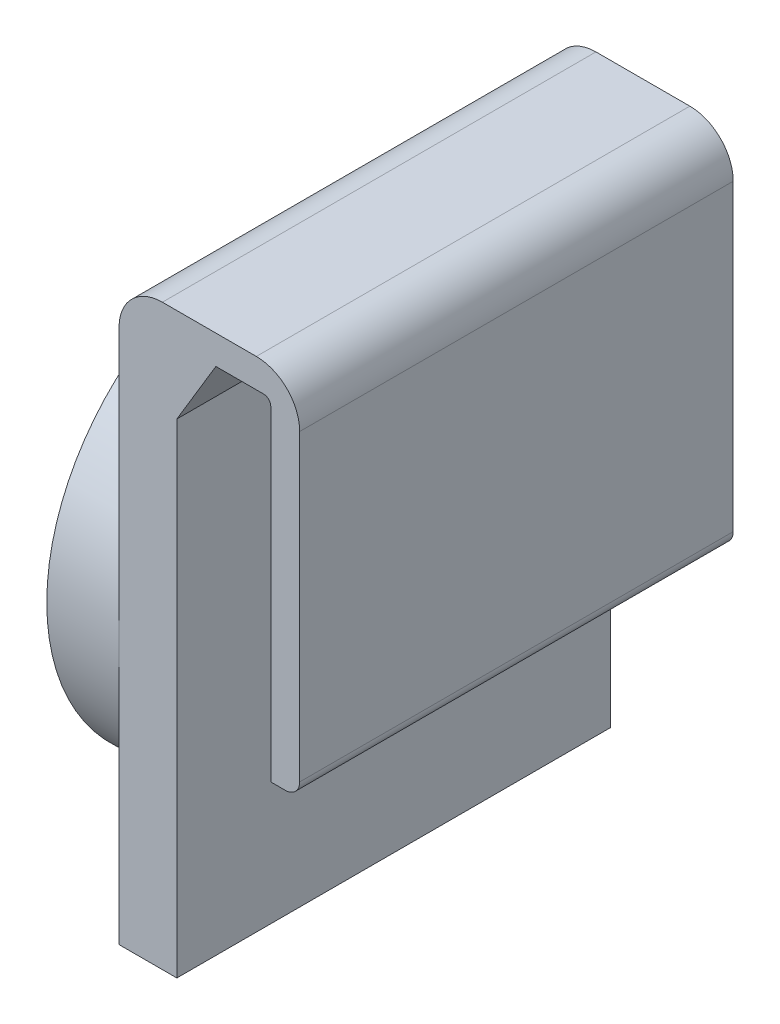
ISO-10303-21;
HEADER;
FILE_DESCRIPTION(('STEP AP214'),'2;1');
FILE_NAME('part.step','',(''),(''),'','','');
FILE_SCHEMA(('AUTOMOTIVE_DESIGN { 1 0 10303 214 1 1 1 1 }'));
ENDSEC;
DATA;
#1=APPLICATION_CONTEXT('core data for automotive mechanical design processes');
#2=APPLICATION_PROTOCOL_DEFINITION('international standard','automotive_design',2000,#1);
#3=PRODUCT_CONTEXT('',#1,'mechanical');
#4=PRODUCT('Part','Part','',(#3));
#5=PRODUCT_RELATED_PRODUCT_CATEGORY('part','',(#4));
#6=PRODUCT_DEFINITION_FORMATION('','',#4);
#7=PRODUCT_DEFINITION_CONTEXT('part definition',#1,'design');
#8=PRODUCT_DEFINITION('design','',#6,#7);
#9=PRODUCT_DEFINITION_SHAPE('','',#8);
#10=(LENGTH_UNIT() NAMED_UNIT(*) SI_UNIT(.MILLI.,.METRE.));
#11=(NAMED_UNIT(*) PLANE_ANGLE_UNIT() SI_UNIT($,.RADIAN.));
#12=(NAMED_UNIT(*) SI_UNIT($,.STERADIAN.) SOLID_ANGLE_UNIT());
#13=UNCERTAINTY_MEASURE_WITH_UNIT(LENGTH_MEASURE(1.E-05),#10,'distance_accuracy_value','');
#14=(GEOMETRIC_REPRESENTATION_CONTEXT(3) GLOBAL_UNCERTAINTY_ASSIGNED_CONTEXT((#13)) GLOBAL_UNIT_ASSIGNED_CONTEXT((#10,
#11,#12)) REPRESENTATION_CONTEXT('',''));
#15=CARTESIAN_POINT('',(0.,0.,0.));
#16=DIRECTION('',(0.,0.,1.));
#17=DIRECTION('',(1.,0.,0.));
#18=AXIS2_PLACEMENT_3D('',#15,#16,#17);
#19=CARTESIAN_POINT('',(0.,0.,30.));
#20=DIRECTION('',(1.,0.,0.));
#21=DIRECTION('',(0.,0.,-1.));
#22=AXIS2_PLACEMENT_3D('',#19,#20,#21);
#23=PLANE('',#22);
#24=CARTESIAN_POINT('',(0.,18.,15.));
#25=DIRECTION('',(-1.,0.,0.));
#26=DIRECTION('',(0.,0.,1.));
#27=AXIS2_PLACEMENT_3D('',#24,#25,#26);
#28=CIRCLE('',#27,15.);
#29=CARTESIAN_POINT('',(0.,18.,0.));
#30=VERTEX_POINT('',#29);
#31=CARTESIAN_POINT('',(0.,18.,30.));
#32=VERTEX_POINT('',#31);
#33=EDGE_CURVE('E154',#30,#32,#28,.T.);
#34=ORIENTED_EDGE('',*,*,#33,.F.);
#35=DIRECTION('',(0.,-1.,0.));
#36=VECTOR('',#35,1.);
#37=CARTESIAN_POINT('',(0.,0.,0.));
#38=LINE('',#37,#36);
#39=CARTESIAN_POINT('',(0.,0.,0.));
#40=VERTEX_POINT('',#39);
#41=EDGE_CURVE('E141',#30,#40,#38,.T.);
#42=ORIENTED_EDGE('',*,*,#41,.T.);
#43=DIRECTION('',(0.,0.,-1.));
#44=VECTOR('',#43,1.);
#45=CARTESIAN_POINT('',(0.,0.,30.));
#46=LINE('',#45,#44);
#47=CARTESIAN_POINT('',(0.,0.,30.));
#48=VERTEX_POINT('',#47);
#49=EDGE_CURVE('E186',#48,#40,#46,.T.);
#50=ORIENTED_EDGE('',*,*,#49,.F.);
#51=DIRECTION('',(0.,-1.,0.));
#52=VECTOR('',#51,1.);
#53=CARTESIAN_POINT('',(0.,0.,30.));
#54=LINE('',#53,#52);
#55=EDGE_CURVE('E155',#32,#48,#54,.T.);
#56=ORIENTED_EDGE('',*,*,#55,.F.);
#57=EDGE_LOOP('',(#34,#42,#50,#56));
#58=FACE_BOUND('',#57,.T.);
#59=ADVANCED_FACE('F33',(#58),#23,.F.);
#60=EDGE_CURVE('E48',#32,#30,#28,.T.);
#61=ORIENTED_EDGE('',*,*,#60,.F.);
#62=CARTESIAN_POINT('',(0.,37.,30.));
#63=VERTEX_POINT('',#62);
#64=EDGE_CURVE('E184',#63,#32,#54,.T.);
#65=ORIENTED_EDGE('',*,*,#64,.F.);
#66=DIRECTION('',(0.,0.,-1.));
#67=VECTOR('',#66,1.);
#68=CARTESIAN_POINT('',(0.,37.,30.));
#69=LINE('',#68,#67);
#70=CARTESIAN_POINT('',(0.,37.,0.));
#71=VERTEX_POINT('',#70);
#72=EDGE_CURVE('E138',#63,#71,#69,.T.);
#73=ORIENTED_EDGE('',*,*,#72,.T.);
#74=EDGE_CURVE('E134',#71,#30,#38,.T.);
#75=ORIENTED_EDGE('',*,*,#74,.T.);
#76=EDGE_LOOP('',(#61,#65,#73,#75));
#77=FACE_BOUND('',#76,.T.);
#78=ADVANCED_FACE('F136',(#77),#23,.F.);
#79=CARTESIAN_POINT('',(4.,0.,30.));
#80=DIRECTION('',(0.,1.,0.));
#81=DIRECTION('',(-1.,0.,0.));
#82=AXIS2_PLACEMENT_3D('',#79,#80,#81);
#83=PLANE('',#82);
#84=DIRECTION('',(1.,0.,0.));
#85=VECTOR('',#84,1.);
#86=CARTESIAN_POINT('',(4.,0.,0.));
#87=LINE('',#86,#85);
#88=CARTESIAN_POINT('',(4.,0.,0.));
#89=VERTEX_POINT('',#88);
#90=EDGE_CURVE('E148',#40,#89,#87,.T.);
#91=ORIENTED_EDGE('',*,*,#90,.T.);
#92=DIRECTION('',(0.,0.,-1.));
#93=VECTOR('',#92,1.);
#94=CARTESIAN_POINT('',(4.,0.,30.));
#95=LINE('',#94,#93);
#96=CARTESIAN_POINT('',(4.,0.,30.));
#97=VERTEX_POINT('',#96);
#98=EDGE_CURVE('E213',#97,#89,#95,.T.);
#99=ORIENTED_EDGE('',*,*,#98,.F.);
#100=DIRECTION('',(1.,0.,0.));
#101=VECTOR('',#100,1.);
#102=CARTESIAN_POINT('',(4.,0.,30.));
#103=LINE('',#102,#101);
#104=EDGE_CURVE('E140',#48,#97,#103,.T.);
#105=ORIENTED_EDGE('',*,*,#104,.F.);
#106=ORIENTED_EDGE('',*,*,#49,.T.);
#107=EDGE_LOOP('',(#91,#99,#105,#106));
#108=FACE_BOUND('',#107,.T.);
#109=ADVANCED_FACE('F275',(#108),#83,.F.);
#110=CARTESIAN_POINT('',(4.,33.5,30.));
#111=DIRECTION('',(-1.,0.,0.));
#112=DIRECTION('',(0.,-1.,0.));
#113=AXIS2_PLACEMENT_3D('',#110,#111,#112);
#114=PLANE('',#113);
#115=DIRECTION('',(0.,1.,0.));
#116=VECTOR('',#115,1.);
#117=CARTESIAN_POINT('',(4.,33.5,0.));
#118=LINE('',#117,#116);
#119=CARTESIAN_POINT('',(4.,33.5,0.));
#120=VERTEX_POINT('',#119);
#121=EDGE_CURVE('E188',#89,#120,#118,.T.);
#122=ORIENTED_EDGE('',*,*,#121,.T.);
#123=DIRECTION('',(0.,0.,-1.));
#124=VECTOR('',#123,1.);
#125=CARTESIAN_POINT('',(4.,33.5,30.));
#126=LINE('',#125,#124);
#127=CARTESIAN_POINT('',(4.,33.5,30.));
#128=VERTEX_POINT('',#127);
#129=EDGE_CURVE('E210',#128,#120,#126,.T.);
#130=ORIENTED_EDGE('',*,*,#129,.F.);
#131=DIRECTION('',(0.,1.,0.));
#132=VECTOR('',#131,1.);
#133=CARTESIAN_POINT('',(4.,33.5,30.));
#134=LINE('',#133,#132);
#135=EDGE_CURVE('E168',#97,#128,#134,.T.);
#136=ORIENTED_EDGE('',*,*,#135,.F.);
#137=ORIENTED_EDGE('',*,*,#98,.T.);
#138=EDGE_LOOP('',(#122,#130,#136,#137));
#139=FACE_BOUND('',#138,.T.);
#140=ADVANCED_FACE('F277',(#139),#114,.F.);
#141=CARTESIAN_POINT('',(6.69999999999999,38.,30.));
#142=DIRECTION('',(-0.857492925712544,0.514495755427527,0.));
#143=DIRECTION('',(-0.514495755427527,-0.857492925712544,0.));
#144=AXIS2_PLACEMENT_3D('',#141,#142,#143);
#145=PLANE('',#144);
#146=DIRECTION('',(0.514495755427527,0.857492925712544,0.));
#147=VECTOR('',#146,1.);
#148=CARTESIAN_POINT('',(6.69999999999999,38.,0.));
#149=LINE('',#148,#147);
#150=CARTESIAN_POINT('',(6.69999999999999,38.,0.));
#151=VERTEX_POINT('',#150);
#152=EDGE_CURVE('E190',#120,#151,#149,.T.);
#153=ORIENTED_EDGE('',*,*,#152,.T.);
#154=DIRECTION('',(0.,0.,-1.));
#155=VECTOR('',#154,1.);
#156=CARTESIAN_POINT('',(6.69999999999999,38.,30.));
#157=LINE('',#156,#155);
#158=CARTESIAN_POINT('',(6.69999999999999,38.,30.));
#159=VERTEX_POINT('',#158);
#160=EDGE_CURVE('E207',#159,#151,#157,.T.);
#161=ORIENTED_EDGE('',*,*,#160,.F.);
#162=DIRECTION('',(0.514495755427527,0.857492925712544,0.));
#163=VECTOR('',#162,1.);
#164=CARTESIAN_POINT('',(6.69999999999999,38.,30.));
#165=LINE('',#164,#163);
#166=EDGE_CURVE('E170',#128,#159,#165,.T.);
#167=ORIENTED_EDGE('',*,*,#166,.F.);
#168=ORIENTED_EDGE('',*,*,#129,.T.);
#169=EDGE_LOOP('',(#153,#161,#167,#168));
#170=FACE_BOUND('',#169,.T.);
#171=ADVANCED_FACE('F284',(#170),#145,.F.);
#172=CARTESIAN_POINT('',(10.5,38.,30.));
#173=DIRECTION('',(0.,1.,0.));
#174=DIRECTION('',(0.,0.,1.));
#175=AXIS2_PLACEMENT_3D('',#172,#173,#174);
#176=PLANE('',#175);
#177=DIRECTION('',(1.,0.,0.));
#178=VECTOR('',#177,1.);
#179=CARTESIAN_POINT('',(10.5,38.,0.));
#180=LINE('',#179,#178);
#181=CARTESIAN_POINT('',(9.99999999999999,38.,0.));
#182=VERTEX_POINT('',#181);
#183=EDGE_CURVE('E192',#151,#182,#180,.T.);
#184=ORIENTED_EDGE('',*,*,#183,.T.);
#185=DIRECTION('',(0.,0.,-1.));
#186=VECTOR('',#185,1.);
#187=CARTESIAN_POINT('',(9.99999999999999,38.,30.));
#188=LINE('',#187,#186);
#189=CARTESIAN_POINT('',(9.99999999999999,38.,30.));
#190=VERTEX_POINT('',#189);
#191=EDGE_CURVE('E237',#182,#190,#188,.F.);
#192=ORIENTED_EDGE('',*,*,#191,.T.);
#193=DIRECTION('',(1.,0.,0.));
#194=VECTOR('',#193,1.);
#195=CARTESIAN_POINT('',(10.5,38.,30.));
#196=LINE('',#195,#194);
#197=EDGE_CURVE('E172',#159,#190,#196,.T.);
#198=ORIENTED_EDGE('',*,*,#197,.F.);
#199=ORIENTED_EDGE('',*,*,#160,.T.);
#200=EDGE_LOOP('',(#184,#192,#198,#199));
#201=FACE_BOUND('',#200,.T.);
#202=ADVANCED_FACE('F288',(#201),#176,.F.);
#203=CARTESIAN_POINT('',(10.5,15.,30.));
#204=DIRECTION('',(1.,0.,0.));
#205=DIRECTION('',(0.,0.,-1.));
#206=AXIS2_PLACEMENT_3D('',#203,#204,#205);
#207=PLANE('',#206);
#208=DIRECTION('',(0.,-1.,0.));
#209=VECTOR('',#208,1.);
#210=CARTESIAN_POINT('',(10.5,15.,30.));
#211=LINE('',#210,#209);
#212=CARTESIAN_POINT('',(10.5,37.5,30.));
#213=VERTEX_POINT('',#212);
#214=CARTESIAN_POINT('',(10.5,15.,30.));
#215=VERTEX_POINT('',#214);
#216=EDGE_CURVE('E175',#213,#215,#211,.T.);
#217=ORIENTED_EDGE('',*,*,#216,.F.);
#218=DIRECTION('',(0.,0.,-1.));
#219=VECTOR('',#218,1.);
#220=CARTESIAN_POINT('',(10.5,37.5,0.));
#221=LINE('',#220,#219);
#222=CARTESIAN_POINT('',(10.5,37.5,0.));
#223=VERTEX_POINT('',#222);
#224=EDGE_CURVE('E234',#213,#223,#221,.T.);
#225=ORIENTED_EDGE('',*,*,#224,.T.);
#226=DIRECTION('',(0.,-1.,0.));
#227=VECTOR('',#226,1.);
#228=CARTESIAN_POINT('',(10.5,15.,0.));
#229=LINE('',#228,#227);
#230=CARTESIAN_POINT('',(10.5,15.,0.));
#231=VERTEX_POINT('',#230);
#232=EDGE_CURVE('E195',#223,#231,#229,.T.);
#233=ORIENTED_EDGE('',*,*,#232,.T.);
#234=DIRECTION('',(0.,0.,-1.));
#235=VECTOR('',#234,1.);
#236=CARTESIAN_POINT('',(10.5,15.,30.));
#237=LINE('',#236,#235);
#238=EDGE_CURVE('E204',#215,#231,#237,.T.);
#239=ORIENTED_EDGE('',*,*,#238,.F.);
#240=EDGE_LOOP('',(#217,#225,#233,#239));
#241=FACE_BOUND('',#240,.T.);
#242=ADVANCED_FACE('F295',(#241),#207,.F.);
#243=CARTESIAN_POINT('',(12.5,15.,30.));
#244=DIRECTION('',(0.,1.,0.));
#245=DIRECTION('',(0.,0.,1.));
#246=AXIS2_PLACEMENT_3D('',#243,#244,#245);
#247=PLANE('',#246);
#248=DIRECTION('',(1.,0.,0.));
#249=VECTOR('',#248,1.);
#250=CARTESIAN_POINT('',(12.5,15.,0.));
#251=LINE('',#250,#249);
#252=CARTESIAN_POINT('',(11.5,15.,0.));
#253=VERTEX_POINT('',#252);
#254=EDGE_CURVE('E197',#231,#253,#251,.T.);
#255=ORIENTED_EDGE('',*,*,#254,.T.);
#256=DIRECTION('',(0.,0.,-1.));
#257=VECTOR('',#256,1.);
#258=CARTESIAN_POINT('',(11.5,15.,30.));
#259=LINE('',#258,#257);
#260=CARTESIAN_POINT('',(11.5,15.,30.));
#261=VERTEX_POINT('',#260);
#262=EDGE_CURVE('E41',#253,#261,#259,.F.);
#263=ORIENTED_EDGE('',*,*,#262,.T.);
#264=DIRECTION('',(1.,0.,0.));
#265=VECTOR('',#264,1.);
#266=CARTESIAN_POINT('',(12.5,15.,30.));
#267=LINE('',#266,#265);
#268=EDGE_CURVE('E177',#215,#261,#267,.T.);
#269=ORIENTED_EDGE('',*,*,#268,.F.);
#270=ORIENTED_EDGE('',*,*,#238,.T.);
#271=EDGE_LOOP('',(#255,#263,#269,#270));
#272=FACE_BOUND('',#271,.T.);
#273=ADVANCED_FACE('F251',(#272),#247,.F.);
#274=CARTESIAN_POINT('',(12.5,40.,30.));
#275=DIRECTION('',(-1.,0.,0.));
#276=DIRECTION('',(0.,-1.,0.));
#277=AXIS2_PLACEMENT_3D('',#274,#275,#276);
#278=PLANE('',#277);
#279=DIRECTION('',(0.,1.,0.));
#280=VECTOR('',#279,1.);
#281=CARTESIAN_POINT('',(12.5,40.,30.));
#282=LINE('',#281,#280);
#283=CARTESIAN_POINT('',(12.5,16.,30.));
#284=VERTEX_POINT('',#283);
#285=CARTESIAN_POINT('',(12.5,37.,30.));
#286=VERTEX_POINT('',#285);
#287=EDGE_CURVE('E179',#284,#286,#282,.T.);
#288=ORIENTED_EDGE('',*,*,#287,.F.);
#289=DIRECTION('',(0.,0.,-1.));
#290=VECTOR('',#289,1.);
#291=CARTESIAN_POINT('',(12.5,16.,30.));
#292=LINE('',#291,#290);
#293=CARTESIAN_POINT('',(12.5,16.,0.));
#294=VERTEX_POINT('',#293);
#295=EDGE_CURVE('E243',#284,#294,#292,.T.);
#296=ORIENTED_EDGE('',*,*,#295,.T.);
#297=DIRECTION('',(0.,1.,0.));
#298=VECTOR('',#297,1.);
#299=CARTESIAN_POINT('',(12.5,40.,0.));
#300=LINE('',#299,#298);
#301=CARTESIAN_POINT('',(12.5,37.,0.));
#302=VERTEX_POINT('',#301);
#303=EDGE_CURVE('E199',#294,#302,#300,.T.);
#304=ORIENTED_EDGE('',*,*,#303,.T.);
#305=DIRECTION('',(0.,0.,-1.));
#306=VECTOR('',#305,1.);
#307=CARTESIAN_POINT('',(12.5,37.,30.));
#308=LINE('',#307,#306);
#309=EDGE_CURVE('E226',#302,#286,#308,.F.);
#310=ORIENTED_EDGE('',*,*,#309,.T.);
#311=EDGE_LOOP('',(#288,#296,#304,#310));
#312=FACE_BOUND('',#311,.T.);
#313=ADVANCED_FACE('F258',(#312),#278,.F.);
#314=CARTESIAN_POINT('',(0.,40.,30.));
#315=DIRECTION('',(0.,-1.,0.));
#316=DIRECTION('',(0.,0.,-1.));
#317=AXIS2_PLACEMENT_3D('',#314,#315,#316);
#318=PLANE('',#317);
#319=DIRECTION('',(-1.,0.,0.));
#320=VECTOR('',#319,1.);
#321=CARTESIAN_POINT('',(0.,40.,30.));
#322=LINE('',#321,#320);
#323=CARTESIAN_POINT('',(9.49999999999999,40.,30.));
#324=VERTEX_POINT('',#323);
#325=CARTESIAN_POINT('',(3.,40.,30.));
#326=VERTEX_POINT('',#325);
#327=EDGE_CURVE('E181',#324,#326,#322,.T.);
#328=ORIENTED_EDGE('',*,*,#327,.F.);
#329=DIRECTION('',(0.,0.,-1.));
#330=VECTOR('',#329,1.);
#331=CARTESIAN_POINT('',(9.49999999999999,40.,30.));
#332=LINE('',#331,#330);
#333=CARTESIAN_POINT('',(9.49999999999999,40.,0.));
#334=VERTEX_POINT('',#333);
#335=EDGE_CURVE('E218',#324,#334,#332,.T.);
#336=ORIENTED_EDGE('',*,*,#335,.T.);
#337=DIRECTION('',(-1.,0.,0.));
#338=VECTOR('',#337,1.);
#339=CARTESIAN_POINT('',(0.,40.,0.));
#340=LINE('',#339,#338);
#341=CARTESIAN_POINT('',(3.,40.,0.));
#342=VERTEX_POINT('',#341);
#343=EDGE_CURVE('E152',#334,#342,#340,.T.);
#344=ORIENTED_EDGE('',*,*,#343,.T.);
#345=DIRECTION('',(0.,0.,-1.));
#346=VECTOR('',#345,1.);
#347=CARTESIAN_POINT('',(3.,40.,30.));
#348=LINE('',#347,#346);
#349=EDGE_CURVE('E216',#342,#326,#348,.F.);
#350=ORIENTED_EDGE('',*,*,#349,.T.);
#351=EDGE_LOOP('',(#328,#336,#344,#350));
#352=FACE_BOUND('',#351,.T.);
#353=ADVANCED_FACE('F267',(#352),#318,.F.);
#354=CARTESIAN_POINT('',(0.,0.,30.));
#355=DIRECTION('',(0.,0.,-1.));
#356=DIRECTION('',(-1.,0.,0.));
#357=AXIS2_PLACEMENT_3D('',#354,#355,#356);
#358=PLANE('',#357);
#359=ORIENTED_EDGE('',*,*,#268,.T.);
#360=CARTESIAN_POINT('',(11.5,16.,30.));
#361=DIRECTION('',(0.,0.,-1.));
#362=DIRECTION('',(-1.,0.,0.));
#363=AXIS2_PLACEMENT_3D('',#360,#361,#362);
#364=CIRCLE('',#363,1.);
#365=EDGE_CURVE('E11',#261,#284,#364,.F.);
#366=ORIENTED_EDGE('',*,*,#365,.T.);
#367=ORIENTED_EDGE('',*,*,#287,.T.);
#368=CARTESIAN_POINT('',(9.49999999999999,37.,30.));
#369=DIRECTION('',(0.,0.,-1.));
#370=DIRECTION('',(-1.,0.,0.));
#371=AXIS2_PLACEMENT_3D('',#368,#369,#370);
#372=CIRCLE('',#371,3.);
#373=EDGE_CURVE('E231',#286,#324,#372,.F.);
#374=ORIENTED_EDGE('',*,*,#373,.T.);
#375=ORIENTED_EDGE('',*,*,#327,.T.);
#376=CARTESIAN_POINT('',(3.,37.,30.));
#377=DIRECTION('',(0.,0.,-1.));
#378=DIRECTION('',(-1.,0.,0.));
#379=AXIS2_PLACEMENT_3D('',#376,#377,#378);
#380=CIRCLE('',#379,3.);
#381=EDGE_CURVE('E229',#326,#63,#380,.F.);
#382=ORIENTED_EDGE('',*,*,#381,.T.);
#383=ORIENTED_EDGE('',*,*,#64,.T.);
#384=ORIENTED_EDGE('',*,*,#55,.T.);
#385=ORIENTED_EDGE('',*,*,#104,.T.);
#386=ORIENTED_EDGE('',*,*,#135,.T.);
#387=ORIENTED_EDGE('',*,*,#166,.T.);
#388=ORIENTED_EDGE('',*,*,#197,.T.);
#389=CARTESIAN_POINT('',(9.99999999999999,37.5,30.));
#390=DIRECTION('',(0.,0.,-1.));
#391=DIRECTION('',(-1.,0.,0.));
#392=AXIS2_PLACEMENT_3D('',#389,#390,#391);
#393=CIRCLE('',#392,0.5);
#394=EDGE_CURVE('E241',#190,#213,#393,.T.);
#395=ORIENTED_EDGE('',*,*,#394,.T.);
#396=ORIENTED_EDGE('',*,*,#216,.T.);
#397=EDGE_LOOP('',(#359,#366,#367,#374,#375,#382,#383,#384,#385,#386,#387,#388,#395,#396));
#398=FACE_BOUND('',#397,.T.);
#399=ADVANCED_FACE('F256',(#398),#358,.F.);
#400=CARTESIAN_POINT('',(0.,0.,0.));
#401=DIRECTION('',(0.,0.,-1.));
#402=DIRECTION('',(-1.,0.,0.));
#403=AXIS2_PLACEMENT_3D('',#400,#401,#402);
#404=PLANE('',#403);
#405=ORIENTED_EDGE('',*,*,#303,.F.);
#406=CARTESIAN_POINT('',(11.5,16.,0.));
#407=DIRECTION('',(0.,0.,-1.));
#408=DIRECTION('',(-1.,0.,0.));
#409=AXIS2_PLACEMENT_3D('',#406,#407,#408);
#410=CIRCLE('',#409,1.);
#411=EDGE_CURVE('E246',#294,#253,#410,.T.);
#412=ORIENTED_EDGE('',*,*,#411,.T.);
#413=ORIENTED_EDGE('',*,*,#254,.F.);
#414=ORIENTED_EDGE('',*,*,#232,.F.);
#415=CARTESIAN_POINT('',(9.99999999999999,37.5,0.));
#416=DIRECTION('',(0.,0.,-1.));
#417=DIRECTION('',(-1.,0.,0.));
#418=AXIS2_PLACEMENT_3D('',#415,#416,#417);
#419=CIRCLE('',#418,0.5);
#420=EDGE_CURVE('E239',#223,#182,#419,.F.);
#421=ORIENTED_EDGE('',*,*,#420,.T.);
#422=ORIENTED_EDGE('',*,*,#183,.F.);
#423=ORIENTED_EDGE('',*,*,#152,.F.);
#424=ORIENTED_EDGE('',*,*,#121,.F.);
#425=ORIENTED_EDGE('',*,*,#90,.F.);
#426=ORIENTED_EDGE('',*,*,#41,.F.);
#427=ORIENTED_EDGE('',*,*,#74,.F.);
#428=CARTESIAN_POINT('',(3.,37.,0.));
#429=DIRECTION('',(0.,0.,-1.));
#430=DIRECTION('',(-1.,0.,0.));
#431=AXIS2_PLACEMENT_3D('',#428,#429,#430);
#432=CIRCLE('',#431,3.);
#433=EDGE_CURVE('E221',#71,#342,#432,.T.);
#434=ORIENTED_EDGE('',*,*,#433,.T.);
#435=ORIENTED_EDGE('',*,*,#343,.F.);
#436=CARTESIAN_POINT('',(9.49999999999999,37.,0.));
#437=DIRECTION('',(0.,0.,-1.));
#438=DIRECTION('',(-1.,0.,0.));
#439=AXIS2_PLACEMENT_3D('',#436,#437,#438);
#440=CIRCLE('',#439,3.);
#441=EDGE_CURVE('E223',#334,#302,#440,.T.);
#442=ORIENTED_EDGE('',*,*,#441,.T.);
#443=EDGE_LOOP('',(#405,#412,#413,#414,#421,#422,#423,#424,#425,#426,#427,#434,#435,#442));
#444=FACE_BOUND('',#443,.T.);
#445=ADVANCED_FACE('F146',(#444),#404,.T.);
#446=CARTESIAN_POINT('',(9.49999999999999,37.,30.));
#447=DIRECTION('',(0.,0.,-1.));
#448=DIRECTION('',(-1.,0.,0.));
#449=AXIS2_PLACEMENT_3D('',#446,#447,#448);
#450=CYLINDRICAL_SURFACE('',#449,3.);
#451=ORIENTED_EDGE('',*,*,#373,.F.);
#452=ORIENTED_EDGE('',*,*,#309,.F.);
#453=ORIENTED_EDGE('',*,*,#441,.F.);
#454=ORIENTED_EDGE('',*,*,#335,.F.);
#455=EDGE_LOOP('',(#451,#452,#453,#454));
#456=FACE_BOUND('',#455,.T.);
#457=ADVANCED_FACE('F263',(#456),#450,.T.);
#458=CARTESIAN_POINT('',(3.,37.,30.));
#459=DIRECTION('',(0.,0.,-1.));
#460=DIRECTION('',(-1.,0.,0.));
#461=AXIS2_PLACEMENT_3D('',#458,#459,#460);
#462=CYLINDRICAL_SURFACE('',#461,3.);
#463=ORIENTED_EDGE('',*,*,#381,.F.);
#464=ORIENTED_EDGE('',*,*,#349,.F.);
#465=ORIENTED_EDGE('',*,*,#433,.F.);
#466=ORIENTED_EDGE('',*,*,#72,.F.);
#467=EDGE_LOOP('',(#463,#464,#465,#466));
#468=FACE_BOUND('',#467,.T.);
#469=ADVANCED_FACE('F271',(#468),#462,.T.);
#470=CARTESIAN_POINT('',(9.99999999999999,37.5,30.));
#471=DIRECTION('',(0.,0.,1.));
#472=DIRECTION('',(1.,0.,0.));
#473=AXIS2_PLACEMENT_3D('',#470,#471,#472);
#474=CYLINDRICAL_SURFACE('',#473,0.5);
#475=ORIENTED_EDGE('',*,*,#394,.F.);
#476=ORIENTED_EDGE('',*,*,#191,.F.);
#477=ORIENTED_EDGE('',*,*,#420,.F.);
#478=ORIENTED_EDGE('',*,*,#224,.F.);
#479=EDGE_LOOP('',(#475,#476,#477,#478));
#480=FACE_BOUND('',#479,.T.);
#481=ADVANCED_FACE('F291',(#480),#474,.F.);
#482=CARTESIAN_POINT('',(11.5,16.,30.));
#483=DIRECTION('',(0.,0.,-1.));
#484=DIRECTION('',(-1.,0.,0.));
#485=AXIS2_PLACEMENT_3D('',#482,#483,#484);
#486=CYLINDRICAL_SURFACE('',#485,1.);
#487=ORIENTED_EDGE('',*,*,#365,.F.);
#488=ORIENTED_EDGE('',*,*,#262,.F.);
#489=ORIENTED_EDGE('',*,*,#411,.F.);
#490=ORIENTED_EDGE('',*,*,#295,.F.);
#491=EDGE_LOOP('',(#487,#488,#489,#490));
#492=FACE_BOUND('',#491,.T.);
#493=ADVANCED_FACE('F35',(#492),#486,.T.);
#494=CARTESIAN_POINT('',(-5.,18.,15.));
#495=DIRECTION('',(1.,0.,0.));
#496=DIRECTION('',(0.,0.,-1.));
#497=AXIS2_PLACEMENT_3D('',#494,#495,#496);
#498=CYLINDRICAL_SURFACE('',#497,15.);
#499=CARTESIAN_POINT('',(-5.,18.,15.));
#500=DIRECTION('',(-1.,0.,0.));
#501=DIRECTION('',(0.,0.,1.));
#502=AXIS2_PLACEMENT_3D('',#499,#500,#501);
#503=CIRCLE('',#502,15.);
#504=CARTESIAN_POINT('',(-5.,18.,30.));
#505=VERTEX_POINT('',#504);
#506=EDGE_CURVE('E161',#505,#505,#503,.T.);
#507=ORIENTED_EDGE('',*,*,#506,.F.);
#508=EDGE_LOOP('',(#507));
#509=FACE_BOUND('',#508,.T.);
#510=ORIENTED_EDGE('',*,*,#60,.T.);
#511=ORIENTED_EDGE('',*,*,#33,.T.);
#512=EDGE_LOOP('',(#510,#511));
#513=FACE_BOUND('',#512,.T.);
#514=ADVANCED_FACE('F160',(#509,#513),#498,.T.);
#515=CARTESIAN_POINT('',(-5.,18.,15.));
#516=DIRECTION('',(-1.,0.,0.));
#517=DIRECTION('',(0.,0.,1.));
#518=AXIS2_PLACEMENT_3D('',#515,#516,#517);
#519=PLANE('',#518);
#520=CARTESIAN_POINT('',(-5.,18.,15.));
#521=DIRECTION('',(-1.,0.,0.));
#522=DIRECTION('',(0.,0.,1.));
#523=AXIS2_PLACEMENT_3D('',#520,#521,#522);
#524=CIRCLE('',#523,10.5);
#525=CARTESIAN_POINT('',(-5.,18.,25.5));
#526=VERTEX_POINT('',#525);
#527=EDGE_CURVE('E462',#526,#526,#524,.T.);
#528=ORIENTED_EDGE('',*,*,#527,.F.);
#529=EDGE_LOOP('',(#528));
#530=FACE_BOUND('',#529,.T.);
#531=ORIENTED_EDGE('',*,*,#506,.T.);
#532=EDGE_LOOP('',(#531));
#533=FACE_BOUND('',#532,.T.);
#534=ADVANCED_FACE('F364',(#530,#533),#519,.T.);
#535=CARTESIAN_POINT('',(2.,18.,15.));
#536=DIRECTION('',(-1.,0.,0.));
#537=DIRECTION('',(0.,0.,1.));
#538=AXIS2_PLACEMENT_3D('',#535,#536,#537);
#539=CYLINDRICAL_SURFACE('',#538,10.5);
#540=CARTESIAN_POINT('',(2.,18.,15.));
#541=DIRECTION('',(-1.,0.,0.));
#542=DIRECTION('',(0.,0.,1.));
#543=AXIS2_PLACEMENT_3D('',#540,#541,#542);
#544=CIRCLE('',#543,10.5);
#545=CARTESIAN_POINT('',(2.,18.,25.5));
#546=VERTEX_POINT('',#545);
#547=EDGE_CURVE('E158',#546,#546,#544,.T.);
#548=ORIENTED_EDGE('',*,*,#547,.F.);
#549=EDGE_LOOP('',(#548));
#550=FACE_BOUND('',#549,.T.);
#551=ORIENTED_EDGE('',*,*,#527,.T.);
#552=EDGE_LOOP('',(#551));
#553=FACE_BOUND('',#552,.T.);
#554=ADVANCED_FACE('F372',(#550,#553),#539,.F.);
#555=CARTESIAN_POINT('',(2.,18.,15.));
#556=DIRECTION('',(-1.,0.,0.));
#557=DIRECTION('',(0.,0.,1.));
#558=AXIS2_PLACEMENT_3D('',#555,#556,#557);
#559=PLANE('',#558);
#560=ORIENTED_EDGE('',*,*,#547,.T.);
#561=EDGE_LOOP('',(#560));
#562=FACE_BOUND('',#561,.T.);
#563=ADVANCED_FACE('F380',(#562),#559,.T.);
#564=CLOSED_SHELL('',(#59,#78,#109,#140,#171,#202,#242,#273,#313,#353,#399,#445,#457,#469,#481,
#493,#514,#534,#554,#563));
#565=MANIFOLD_SOLID_BREP('B2',#564);
#566=ADVANCED_BREP_SHAPE_REPRESENTATION('',(#18,#565),#14);
#567=SHAPE_DEFINITION_REPRESENTATION(#9,#566);
ENDSEC;
END-ISO-10303-21;
